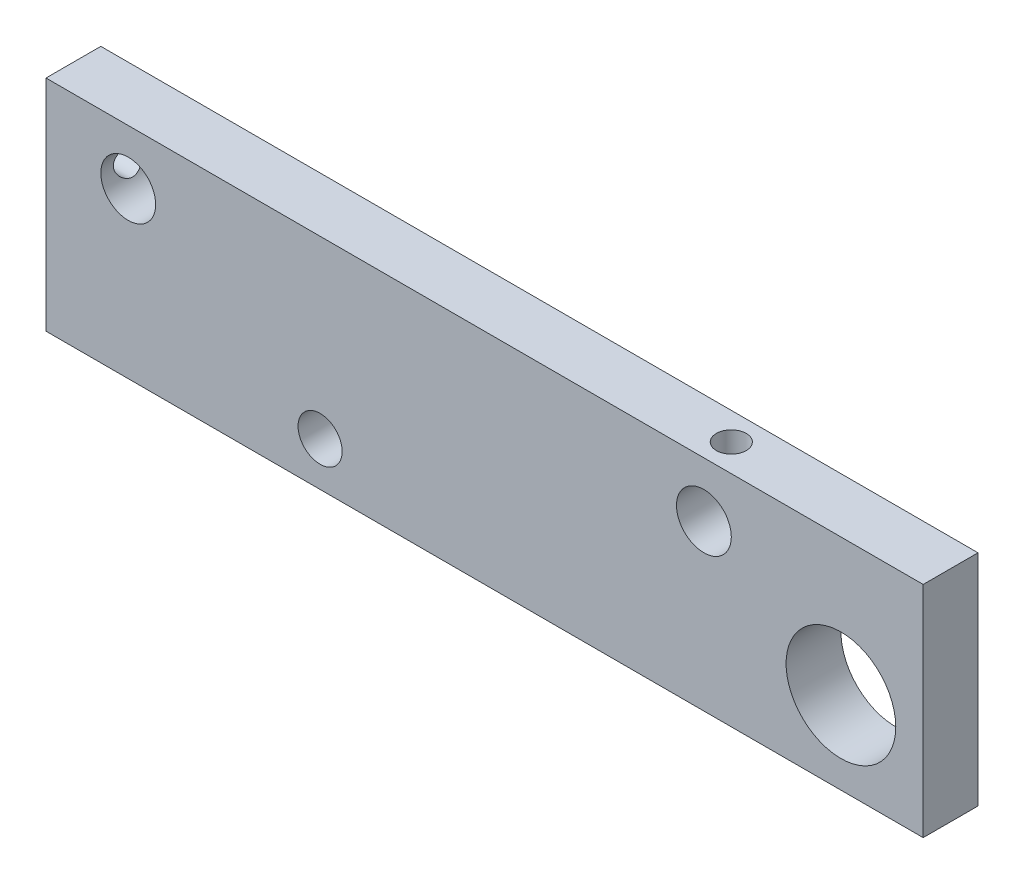
ISO-10303-21;
HEADER;
FILE_DESCRIPTION(('STEP AP214'),'2;1');
FILE_NAME('part.step','',(''),(''),'','','');
FILE_SCHEMA(('AUTOMOTIVE_DESIGN { 1 0 10303 214 1 1 1 1 }'));
ENDSEC;
DATA;
#1=APPLICATION_CONTEXT('core data for automotive mechanical design processes');
#2=APPLICATION_PROTOCOL_DEFINITION('international standard','automotive_design',2000,#1);
#3=PRODUCT_CONTEXT('',#1,'mechanical');
#4=PRODUCT('Part','Part','',(#3));
#5=PRODUCT_RELATED_PRODUCT_CATEGORY('part','',(#4));
#6=PRODUCT_DEFINITION_FORMATION('','',#4);
#7=PRODUCT_DEFINITION_CONTEXT('part definition',#1,'design');
#8=PRODUCT_DEFINITION('design','',#6,#7);
#9=PRODUCT_DEFINITION_SHAPE('','',#8);
#10=(LENGTH_UNIT() NAMED_UNIT(*) SI_UNIT(.MILLI.,.METRE.));
#11=(NAMED_UNIT(*) PLANE_ANGLE_UNIT() SI_UNIT($,.RADIAN.));
#12=(NAMED_UNIT(*) SI_UNIT($,.STERADIAN.) SOLID_ANGLE_UNIT());
#13=UNCERTAINTY_MEASURE_WITH_UNIT(LENGTH_MEASURE(1.E-05),#10,'distance_accuracy_value','');
#14=(GEOMETRIC_REPRESENTATION_CONTEXT(3) GLOBAL_UNCERTAINTY_ASSIGNED_CONTEXT((#13)) GLOBAL_UNIT_ASSIGNED_CONTEXT((#10,
#11,#12)) REPRESENTATION_CONTEXT('',''));
#15=CARTESIAN_POINT('',(0.,0.,0.));
#16=DIRECTION('',(0.,0.,1.));
#17=DIRECTION('',(1.,0.,0.));
#18=AXIS2_PLACEMENT_3D('',#15,#16,#17);
#19=CARTESIAN_POINT('',(0.,0.,6.35));
#20=DIRECTION('',(0.,0.,-1.));
#21=DIRECTION('',(-1.,0.,0.));
#22=AXIS2_PLACEMENT_3D('',#19,#20,#21);
#23=PLANE('',#22);
#24=CARTESIAN_POINT('',(31.75,5.08,6.35));
#25=DIRECTION('',(0.,0.,-1.));
#26=DIRECTION('',(-1.,0.,0.));
#27=AXIS2_PLACEMENT_3D('',#24,#25,#26);
#28=CIRCLE('',#27,2.5527);
#29=CARTESIAN_POINT('',(29.1973,5.08,6.35));
#30=VERTEX_POINT('',#29);
#31=EDGE_CURVE('E124',#30,#30,#28,.T.);
#32=ORIENTED_EDGE('',*,*,#31,.T.);
#33=EDGE_LOOP('',(#32));
#34=FACE_BOUND('',#33,.T.);
#35=DIRECTION('',(0.,-1.,0.));
#36=VECTOR('',#35,1.);
#37=CARTESIAN_POINT('',(0.,0.,6.35));
#38=LINE('',#37,#36);
#39=CARTESIAN_POINT('',(0.,25.4,6.35));
#40=VERTEX_POINT('',#39);
#41=CARTESIAN_POINT('',(0.,0.,6.35));
#42=VERTEX_POINT('',#41);
#43=EDGE_CURVE('E252',#40,#42,#38,.T.);
#44=ORIENTED_EDGE('',*,*,#43,.T.);
#45=DIRECTION('',(1.,0.,0.));
#46=VECTOR('',#45,1.);
#47=CARTESIAN_POINT('',(0.,0.,6.35));
#48=LINE('',#47,#46);
#49=CARTESIAN_POINT('',(101.6,0.,6.35));
#50=VERTEX_POINT('',#49);
#51=EDGE_CURVE('E91',#42,#50,#48,.T.);
#52=ORIENTED_EDGE('',*,*,#51,.T.);
#53=DIRECTION('',(0.,1.,0.));
#54=VECTOR('',#53,1.);
#55=CARTESIAN_POINT('',(101.6,0.,6.35));
#56=LINE('',#55,#54);
#57=CARTESIAN_POINT('',(101.6,25.4,6.35));
#58=VERTEX_POINT('',#57);
#59=EDGE_CURVE('E245',#50,#58,#56,.T.);
#60=ORIENTED_EDGE('',*,*,#59,.T.);
#61=DIRECTION('',(-1.,0.,0.));
#62=VECTOR('',#61,1.);
#63=CARTESIAN_POINT('',(0.,25.4,6.35));
#64=LINE('',#63,#62);
#65=EDGE_CURVE('E60',#58,#40,#64,.T.);
#66=ORIENTED_EDGE('',*,*,#65,.T.);
#67=EDGE_LOOP('',(#44,#52,#60,#66));
#68=FACE_BOUND('',#67,.T.);
#69=CARTESIAN_POINT('',(92.075,9.525,6.35));
#70=DIRECTION('',(0.,0.,1.));
#71=DIRECTION('',(1.,0.,0.));
#72=AXIS2_PLACEMENT_3D('',#69,#70,#71);
#73=CIRCLE('',#72,6.35000000000001);
#74=CARTESIAN_POINT('',(98.425,9.525,6.35));
#75=VERTEX_POINT('',#74);
#76=EDGE_CURVE('E267',#75,#75,#73,.T.);
#77=ORIENTED_EDGE('',*,*,#76,.F.);
#78=EDGE_LOOP('',(#77));
#79=FACE_BOUND('',#78,.T.);
#80=CARTESIAN_POINT('',(76.2,19.05,6.35));
#81=DIRECTION('',(0.,0.,1.));
#82=DIRECTION('',(1.,0.,0.));
#83=AXIS2_PLACEMENT_3D('',#80,#81,#82);
#84=CIRCLE('',#83,3.175);
#85=CARTESIAN_POINT('',(79.375,19.05,6.35));
#86=VERTEX_POINT('',#85);
#87=EDGE_CURVE('E277',#86,#86,#84,.T.);
#88=ORIENTED_EDGE('',*,*,#87,.F.);
#89=EDGE_LOOP('',(#88));
#90=FACE_BOUND('',#89,.T.);
#91=CARTESIAN_POINT('',(9.525,19.05,6.35));
#92=DIRECTION('',(0.,0.,1.));
#93=DIRECTION('',(1.,0.,0.));
#94=AXIS2_PLACEMENT_3D('',#91,#92,#93);
#95=CIRCLE('',#94,3.175);
#96=CARTESIAN_POINT('',(12.7,19.05,6.35));
#97=VERTEX_POINT('',#96);
#98=EDGE_CURVE('E292',#97,#97,#95,.T.);
#99=ORIENTED_EDGE('',*,*,#98,.F.);
#100=EDGE_LOOP('',(#99));
#101=FACE_BOUND('',#100,.T.);
#102=ADVANCED_FACE('F42',(#34,#68,#79,#90,#101),#23,.F.);
#103=CARTESIAN_POINT('',(0.,0.,0.));
#104=DIRECTION('',(0.,0.,-1.));
#105=DIRECTION('',(-1.,0.,0.));
#106=AXIS2_PLACEMENT_3D('',#103,#104,#105);
#107=PLANE('',#106);
#108=CARTESIAN_POINT('',(31.75,5.08,0.));
#109=DIRECTION('',(0.,0.,-1.));
#110=DIRECTION('',(-1.,0.,0.));
#111=AXIS2_PLACEMENT_3D('',#108,#109,#110);
#112=CIRCLE('',#111,2.55269999999999);
#113=CARTESIAN_POINT('',(29.1973,5.08,0.));
#114=VERTEX_POINT('',#113);
#115=EDGE_CURVE('E480',#114,#114,#112,.T.);
#116=ORIENTED_EDGE('',*,*,#115,.F.);
#117=EDGE_LOOP('',(#116));
#118=FACE_BOUND('',#117,.T.);
#119=CARTESIAN_POINT('',(76.2,19.05,0.));
#120=DIRECTION('',(0.,0.,1.));
#121=DIRECTION('',(1.,0.,0.));
#122=AXIS2_PLACEMENT_3D('',#119,#120,#121);
#123=CIRCLE('',#122,3.175);
#124=CARTESIAN_POINT('',(79.375,19.05,0.));
#125=VERTEX_POINT('',#124);
#126=EDGE_CURVE('E280',#125,#125,#123,.T.);
#127=ORIENTED_EDGE('',*,*,#126,.T.);
#128=EDGE_LOOP('',(#127));
#129=FACE_BOUND('',#128,.T.);
#130=DIRECTION('',(0.,-1.,0.));
#131=VECTOR('',#130,1.);
#132=CARTESIAN_POINT('',(0.,0.,0.));
#133=LINE('',#132,#131);
#134=CARTESIAN_POINT('',(0.,25.4,0.));
#135=VERTEX_POINT('',#134);
#136=CARTESIAN_POINT('',(0.,0.,0.));
#137=VERTEX_POINT('',#136);
#138=EDGE_CURVE('E243',#135,#137,#133,.T.);
#139=ORIENTED_EDGE('',*,*,#138,.F.);
#140=DIRECTION('',(-1.,0.,0.));
#141=VECTOR('',#140,1.);
#142=CARTESIAN_POINT('',(0.,25.4,0.));
#143=LINE('',#142,#141);
#144=CARTESIAN_POINT('',(101.6,25.4,0.));
#145=VERTEX_POINT('',#144);
#146=EDGE_CURVE('E84',#145,#135,#143,.T.);
#147=ORIENTED_EDGE('',*,*,#146,.F.);
#148=DIRECTION('',(0.,1.,0.));
#149=VECTOR('',#148,1.);
#150=CARTESIAN_POINT('',(101.6,0.,0.));
#151=LINE('',#150,#149);
#152=CARTESIAN_POINT('',(101.6,0.,0.));
#153=VERTEX_POINT('',#152);
#154=EDGE_CURVE('E78',#153,#145,#151,.T.);
#155=ORIENTED_EDGE('',*,*,#154,.F.);
#156=DIRECTION('',(1.,0.,0.));
#157=VECTOR('',#156,1.);
#158=CARTESIAN_POINT('',(0.,0.,0.));
#159=LINE('',#158,#157);
#160=EDGE_CURVE('E236',#137,#153,#159,.T.);
#161=ORIENTED_EDGE('',*,*,#160,.F.);
#162=EDGE_LOOP('',(#139,#147,#155,#161));
#163=FACE_BOUND('',#162,.T.);
#164=CARTESIAN_POINT('',(92.075,9.525,0.));
#165=DIRECTION('',(0.,0.,1.));
#166=DIRECTION('',(1.,0.,0.));
#167=AXIS2_PLACEMENT_3D('',#164,#165,#166);
#168=CIRCLE('',#167,6.35000000000001);
#169=CARTESIAN_POINT('',(98.425,9.525,0.));
#170=VERTEX_POINT('',#169);
#171=EDGE_CURVE('E271',#170,#170,#168,.T.);
#172=ORIENTED_EDGE('',*,*,#171,.T.);
#173=EDGE_LOOP('',(#172));
#174=FACE_BOUND('',#173,.T.);
#175=CARTESIAN_POINT('',(9.525,19.05,0.));
#176=DIRECTION('',(0.,0.,1.));
#177=DIRECTION('',(1.,0.,0.));
#178=AXIS2_PLACEMENT_3D('',#175,#176,#177);
#179=CIRCLE('',#178,3.175);
#180=CARTESIAN_POINT('',(12.7,19.05,0.));
#181=VERTEX_POINT('',#180);
#182=EDGE_CURVE('E295',#181,#181,#179,.T.);
#183=ORIENTED_EDGE('',*,*,#182,.T.);
#184=EDGE_LOOP('',(#183));
#185=FACE_BOUND('',#184,.T.);
#186=ADVANCED_FACE('F203',(#118,#129,#163,#174,#185),#107,.T.);
#187=CARTESIAN_POINT('',(0.,0.,6.35));
#188=DIRECTION('',(1.,0.,0.));
#189=DIRECTION('',(0.,0.,-1.));
#190=AXIS2_PLACEMENT_3D('',#187,#188,#189);
#191=PLANE('',#190);
#192=CARTESIAN_POINT('',(0.,19.05,3.175));
#193=DIRECTION('',(-1.,0.,0.));
#194=DIRECTION('',(0.,0.,1.));
#195=AXIS2_PLACEMENT_3D('',#192,#193,#194);
#196=CIRCLE('',#195,1.72719999999999);
#197=CARTESIAN_POINT('',(0.,19.05,4.90219999999999));
#198=VERTEX_POINT('',#197);
#199=EDGE_CURVE('E147',#198,#198,#196,.T.);
#200=ORIENTED_EDGE('',*,*,#199,.F.);
#201=EDGE_LOOP('',(#200));
#202=FACE_BOUND('',#201,.T.);
#203=ORIENTED_EDGE('',*,*,#138,.T.);
#204=DIRECTION('',(0.,0.,-1.));
#205=VECTOR('',#204,1.);
#206=CARTESIAN_POINT('',(0.,0.,6.35));
#207=LINE('',#206,#205);
#208=EDGE_CURVE('E11',#42,#137,#207,.T.);
#209=ORIENTED_EDGE('',*,*,#208,.F.);
#210=ORIENTED_EDGE('',*,*,#43,.F.);
#211=DIRECTION('',(0.,0.,-1.));
#212=VECTOR('',#211,1.);
#213=CARTESIAN_POINT('',(0.,25.4,6.35));
#214=LINE('',#213,#212);
#215=EDGE_CURVE('E256',#40,#135,#214,.T.);
#216=ORIENTED_EDGE('',*,*,#215,.T.);
#217=EDGE_LOOP('',(#203,#209,#210,#216));
#218=FACE_BOUND('',#217,.T.);
#219=ADVANCED_FACE('F44',(#202,#218),#191,.F.);
#220=CARTESIAN_POINT('',(0.,0.,6.35));
#221=DIRECTION('',(0.,1.,0.));
#222=DIRECTION('',(0.,0.,1.));
#223=AXIS2_PLACEMENT_3D('',#220,#221,#222);
#224=PLANE('',#223);
#225=CARTESIAN_POINT('',(81.28,0.,3.175));
#226=DIRECTION('',(0.,-1.,0.));
#227=DIRECTION('',(0.,0.,-1.));
#228=AXIS2_PLACEMENT_3D('',#225,#226,#227);
#229=CIRCLE('',#228,1.7272);
#230=CARTESIAN_POINT('',(81.28,0.,1.4478));
#231=VERTEX_POINT('',#230);
#232=EDGE_CURVE('E116',#231,#231,#229,.T.);
#233=ORIENTED_EDGE('',*,*,#232,.F.);
#234=EDGE_LOOP('',(#233));
#235=FACE_BOUND('',#234,.T.);
#236=CARTESIAN_POINT('',(55.88,0.,3.175));
#237=DIRECTION('',(0.,-1.,0.));
#238=DIRECTION('',(0.,0.,-1.));
#239=AXIS2_PLACEMENT_3D('',#236,#237,#238);
#240=CIRCLE('',#239,1.7272);
#241=CARTESIAN_POINT('',(55.88,0.,1.4478));
#242=VERTEX_POINT('',#241);
#243=EDGE_CURVE('E115',#242,#242,#240,.T.);
#244=ORIENTED_EDGE('',*,*,#243,.F.);
#245=EDGE_LOOP('',(#244));
#246=FACE_BOUND('',#245,.T.);
#247=CARTESIAN_POINT('',(12.7,0.,3.175));
#248=DIRECTION('',(0.,-1.,0.));
#249=DIRECTION('',(0.,0.,-1.));
#250=AXIS2_PLACEMENT_3D('',#247,#248,#249);
#251=CIRCLE('',#250,1.7272);
#252=CARTESIAN_POINT('',(12.7,0.,1.4478));
#253=VERTEX_POINT('',#252);
#254=EDGE_CURVE('E131',#253,#253,#251,.T.);
#255=ORIENTED_EDGE('',*,*,#254,.F.);
#256=EDGE_LOOP('',(#255));
#257=FACE_BOUND('',#256,.T.);
#258=CARTESIAN_POINT('',(68.58,0.,3.175));
#259=DIRECTION('',(0.,-1.,0.));
#260=DIRECTION('',(0.,0.,-1.));
#261=AXIS2_PLACEMENT_3D('',#258,#259,#260);
#262=CIRCLE('',#261,1.7272);
#263=CARTESIAN_POINT('',(68.58,0.,1.4478));
#264=VERTEX_POINT('',#263);
#265=EDGE_CURVE('E139',#264,#264,#262,.T.);
#266=ORIENTED_EDGE('',*,*,#265,.F.);
#267=EDGE_LOOP('',(#266));
#268=FACE_BOUND('',#267,.T.);
#269=ORIENTED_EDGE('',*,*,#160,.T.);
#270=DIRECTION('',(0.,0.,-1.));
#271=VECTOR('',#270,1.);
#272=CARTESIAN_POINT('',(101.6,0.,6.35));
#273=LINE('',#272,#271);
#274=EDGE_CURVE('E52',#50,#153,#273,.T.);
#275=ORIENTED_EDGE('',*,*,#274,.F.);
#276=ORIENTED_EDGE('',*,*,#51,.F.);
#277=ORIENTED_EDGE('',*,*,#208,.T.);
#278=EDGE_LOOP('',(#269,#275,#276,#277));
#279=FACE_BOUND('',#278,.T.);
#280=ADVANCED_FACE('F222',(#235,#246,#257,#268,#279),#224,.F.);
#281=CARTESIAN_POINT('',(101.6,0.,6.35));
#282=DIRECTION('',(-1.,0.,0.));
#283=DIRECTION('',(0.,0.,1.));
#284=AXIS2_PLACEMENT_3D('',#281,#282,#283);
#285=PLANE('',#284);
#286=ORIENTED_EDGE('',*,*,#154,.T.);
#287=DIRECTION('',(0.,0.,-1.));
#288=VECTOR('',#287,1.);
#289=CARTESIAN_POINT('',(101.6,25.4,6.35));
#290=LINE('',#289,#288);
#291=EDGE_CURVE('E247',#58,#145,#290,.T.);
#292=ORIENTED_EDGE('',*,*,#291,.F.);
#293=ORIENTED_EDGE('',*,*,#59,.F.);
#294=ORIENTED_EDGE('',*,*,#274,.T.);
#295=EDGE_LOOP('',(#286,#292,#293,#294));
#296=FACE_BOUND('',#295,.T.);
#297=ADVANCED_FACE('F219',(#296),#285,.F.);
#298=CARTESIAN_POINT('',(0.,25.4,6.35));
#299=DIRECTION('',(0.,-1.,0.));
#300=DIRECTION('',(0.,0.,-1.));
#301=AXIS2_PLACEMENT_3D('',#298,#299,#300);
#302=PLANE('',#301);
#303=CARTESIAN_POINT('',(76.2,25.4,3.175));
#304=DIRECTION('',(0.,1.,0.));
#305=DIRECTION('',(0.,0.,1.));
#306=AXIS2_PLACEMENT_3D('',#303,#304,#305);
#307=CIRCLE('',#306,1.72719999999998);
#308=CARTESIAN_POINT('',(76.2,25.4,4.90219999999998));
#309=VERTEX_POINT('',#308);
#310=EDGE_CURVE('E160',#309,#309,#307,.T.);
#311=ORIENTED_EDGE('',*,*,#310,.F.);
#312=EDGE_LOOP('',(#311));
#313=FACE_BOUND('',#312,.T.);
#314=ORIENTED_EDGE('',*,*,#146,.T.);
#315=ORIENTED_EDGE('',*,*,#215,.F.);
#316=ORIENTED_EDGE('',*,*,#65,.F.);
#317=ORIENTED_EDGE('',*,*,#291,.T.);
#318=EDGE_LOOP('',(#314,#315,#316,#317));
#319=FACE_BOUND('',#318,.T.);
#320=ADVANCED_FACE('F216',(#313,#319),#302,.F.);
#321=CARTESIAN_POINT('',(92.075,9.525,6.35));
#322=DIRECTION('',(0.,0.,-1.));
#323=DIRECTION('',(-1.,0.,0.));
#324=AXIS2_PLACEMENT_3D('',#321,#322,#323);
#325=CYLINDRICAL_SURFACE('',#324,6.35000000000001);
#326=ORIENTED_EDGE('',*,*,#76,.T.);
#327=EDGE_LOOP('',(#326));
#328=FACE_BOUND('',#327,.T.);
#329=ORIENTED_EDGE('',*,*,#171,.F.);
#330=EDGE_LOOP('',(#329));
#331=FACE_BOUND('',#330,.T.);
#332=ADVANCED_FACE('F213',(#328,#331),#325,.F.);
#333=CARTESIAN_POINT('',(76.2,19.05,6.35));
#334=DIRECTION('',(0.,0.,-1.));
#335=DIRECTION('',(-1.,0.,0.));
#336=AXIS2_PLACEMENT_3D('',#333,#334,#335);
#337=CYLINDRICAL_SURFACE('',#336,3.175);
#338=CARTESIAN_POINT('',(76.2,22.225,4.90219999999999));
#339=CARTESIAN_POINT('',(76.110183267013,22.224994842001,4.90219426316033));
#340=CARTESIAN_POINT('',(76.0202896032224,22.2211497592581,4.89515353824675));
#341=CARTESIAN_POINT('',(75.8432209639998,22.2061465963456,4.86733214119055));
#342=CARTESIAN_POINT('',(75.7560500680111,22.1949780470802,4.84653179892228));
#343=CARTESIAN_POINT('',(75.5872449194557,22.1664814163209,4.79227558287018));
#344=CARTESIAN_POINT('',(75.5055895883976,22.1491785740184,4.7588715306506));
#345=CARTESIAN_POINT('',(75.3492002679151,22.1099468194807,4.68065998275856));
#346=CARTESIAN_POINT('',(75.2744664814582,22.0880177716484,4.6358521528258));
#347=CARTESIAN_POINT('',(75.1283421284245,22.0397307289578,4.53268302184071));
#348=CARTESIAN_POINT('',(75.0575221493316,22.0131732150285,4.473608560259));
#349=CARTESIAN_POINT('',(74.9262561522438,21.9591664142974,4.34514660815034));
#350=CARTESIAN_POINT('',(74.8658196101394,21.9317163398266,4.27574980409458));
#351=CARTESIAN_POINT('',(74.7511885181865,21.8759530484443,4.12068927626324));
#352=CARTESIAN_POINT('',(74.6981475295464,21.8478092947721,4.03410392840672));
#353=CARTESIAN_POINT('',(74.6075887759796,21.7972815216645,3.85160814769005));
#354=CARTESIAN_POINT('',(74.5700588243197,21.7748929857102,3.75570510902081));
#355=CARTESIAN_POINT('',(74.5142339987558,21.7406945421021,3.56331974847051));
#356=CARTESIAN_POINT('',(74.4948764058784,21.7283071129177,3.46725444315248));
#357=CARTESIAN_POINT('',(74.4727831669528,21.7141210926539,3.27251296602227));
#358=CARTESIAN_POINT('',(74.4700247583745,21.7123080010469,3.1738405560504));
#359=CARTESIAN_POINT('',(74.4804333789233,21.7190305122791,2.9924664257384));
#360=CARTESIAN_POINT('',(74.4913039535474,21.7260742808087,2.90956228487491));
#361=CARTESIAN_POINT('',(74.5246095408713,21.7470494414497,2.74701296463368));
#362=CARTESIAN_POINT('',(74.5470495877459,21.7609838317398,2.66736922023529));
#363=CARTESIAN_POINT('',(74.6031707713032,21.7944201285136,2.5113856243492));
#364=CARTESIAN_POINT('',(74.63708760068,21.814037413562,2.43515650840408));
#365=CARTESIAN_POINT('',(74.7149995166023,21.8566651506685,2.28908015534768));
#366=CARTESIAN_POINT('',(74.7589990023016,21.8796770822756,2.21923572259403));
#367=CARTESIAN_POINT('',(74.8636886602055,21.9307610359601,2.07660391669395));
#368=CARTESIAN_POINT('',(74.9259051322662,21.9590669301131,2.00501637617155));
#369=CARTESIAN_POINT('',(75.0614438541865,22.0147406170481,1.87273880325029));
#370=CARTESIAN_POINT('',(75.1347733419486,22.0421077840868,1.81205592977166));
#371=CARTESIAN_POINT('',(75.2963397847503,22.0949453965869,1.69956420536644));
#372=CARTESIAN_POINT('',(75.3852320372337,22.1201808054116,1.64857662560586));
#373=CARTESIAN_POINT('',(75.5720385009356,22.163752551017,1.56272760937983));
#374=CARTESIAN_POINT('',(75.6699442824126,22.1820952540914,1.52785128524924));
#375=CARTESIAN_POINT('',(75.8623675517872,22.2083501933361,1.47848486278067));
#376=CARTESIAN_POINT('',(75.9563682281967,22.2170667122662,1.46241455863197));
#377=CARTESIAN_POINT('',(76.1461137218816,22.2259596186924,1.44602149624867));
#378=CARTESIAN_POINT('',(76.241857427538,22.2261412707523,1.44568903043899));
#379=CARTESIAN_POINT('',(76.4226303001239,22.2183542676247,1.4600396511867));
#380=CARTESIAN_POINT('',(76.5078119733897,22.2111596471146,1.47329669083816));
#381=CARTESIAN_POINT('',(76.6745264217491,22.1904628928592,1.51205979224464));
#382=CARTESIAN_POINT('',(76.7560588230791,22.1769601146361,1.53756710556591));
#383=CARTESIAN_POINT('',(76.9154369218934,22.1444386365722,1.60055149841364));
#384=CARTESIAN_POINT('',(76.9931516700883,22.1252982339629,1.63829475616213));
#385=CARTESIAN_POINT('',(77.1413556688846,22.0832191228263,1.72433789832278));
#386=CARTESIAN_POINT('',(77.2118421966566,22.0602789914109,1.77264173954321));
#387=CARTESIAN_POINT('',(77.3518792553385,22.0097184673047,1.88453874061452));
#388=CARTESIAN_POINT('',(77.4204665404861,21.9818609907241,1.9492313333052));
#389=CARTESIAN_POINT('',(77.5463260558171,21.9262433303561,2.08896090069408));
#390=CARTESIAN_POINT('',(77.6035869561702,21.8984832710008,2.16400810708042));
#391=CARTESIAN_POINT('',(77.7093040607395,21.843997029641,2.32911456803238));
#392=CARTESIAN_POINT('',(77.7567969583979,21.8174988325876,2.4198733475382));
#393=CARTESIAN_POINT('',(77.8353697529338,21.7718154792425,2.60991790282002));
#394=CARTESIAN_POINT('',(77.8664734230325,21.7526197417534,2.70919108354075));
#395=CARTESIAN_POINT('',(77.9082838229516,21.7263688011258,2.90324719011799));
#396=CARTESIAN_POINT('',(77.9206833212737,21.718312524142,2.99752446352124));
#397=CARTESIAN_POINT('',(77.929756885217,21.7124437414767,3.18712206760348));
#398=CARTESIAN_POINT('',(77.9264433729609,21.7146231438342,3.28244151491501));
#399=CARTESIAN_POINT('',(77.9058275980379,21.7278506136661,3.4581247925225));
#400=CARTESIAN_POINT('',(77.8904112311361,21.7377017050996,3.53881438229933));
#401=CARTESIAN_POINT('',(77.8486703373827,21.7635050374682,3.69629218816028));
#402=CARTESIAN_POINT('',(77.8223415022716,21.7794596879063,3.77307884990559));
#403=CARTESIAN_POINT('',(77.7577484429732,21.816860182444,3.92597018057133));
#404=CARTESIAN_POINT('',(77.7188406927072,21.8385870696544,4.00173178768551));
#405=CARTESIAN_POINT('',(77.6308145793866,21.8847601342395,4.14615951711862));
#406=CARTESIAN_POINT('',(77.5816907545949,21.9092077629188,4.21482181447284));
#407=CARTESIAN_POINT('',(77.4659002763112,21.9625200032383,4.3540303383579));
#408=CARTESIAN_POINT('',(77.3977009735916,21.9914898770765,4.42326849457057));
#409=CARTESIAN_POINT('',(77.2501131647898,22.0473510533415,4.54974712844455));
#410=CARTESIAN_POINT('',(77.170716985738,22.0742409106468,4.60697931121357));
#411=CARTESIAN_POINT('',(76.9996483323246,22.123981265466,4.70928011125118));
#412=CARTESIAN_POINT('',(76.9076728384087,22.1466816659454,4.75391931330015));
#413=CARTESIAN_POINT('',(76.7159912222075,22.1843011288306,4.82648714665707));
#414=CARTESIAN_POINT('',(76.6163060077164,22.1992404432213,4.8544592977591));
#415=CARTESIAN_POINT('',(76.4628760211871,22.2145294100806,4.88289225903148));
#416=CARTESIAN_POINT('',(76.4106508181132,22.2184409225074,4.89011759952543));
#417=CARTESIAN_POINT('',(76.3056259463871,22.2236777304677,4.89977314994272));
#418=CARTESIAN_POINT('',(76.2528262794477,22.2250030337097,4.90220337415852));
#419=CARTESIAN_POINT('',(76.2,22.225,4.90219999999999));
#420=B_SPLINE_CURVE_WITH_KNOTS('',3,(#338,#339,#340,#341,#342,#343,#344,#345,#346,#347,#348,
#349,#350,#351,#352,#353,#354,#355,#356,#357,#358,#359,#360,#361,#362,#363,#364,#365,#366,#367,
#368,#369,#370,#371,#372,#373,#374,#375,#376,#377,#378,#379,#380,#381,#382,#383,#384,#385,#386,
#387,#388,#389,#390,#391,#392,#393,#394,#395,#396,#397,#398,#399,#400,#401,#402,#403,#404,#405,
#406,#407,#408,#409,#410,#411,#412,#413,#414,#415,#416,#417,#418,#419),.UNSPECIFIED.,.T.,.F.,(4,
2,2,2,2,2,2,2,2,2,2,2,2,2,2,2,2,2,2,2,2,2,2,2,2,2,2,2,2,2,2,2,2,2,2,2,2,2,2,2,4),(0.,
0.269237366741938,0.53886045720665,0.807386833520662,1.07592108161609,1.36266948063225,
1.64967819109356,1.96419704531973,2.27846831600627,2.57294341145818,2.86701459980267,
3.11756500584304,3.36822452493013,3.62438021478772,3.88064788119477,4.17633401900357,
4.472213571347,4.78711425412073,5.10172336681181,5.38739145348505,5.67288332913719,
5.93120440761279,6.18955188343686,6.4539459483155,6.71843924587247,7.01214559552771,
7.30614427141863,7.62186818462157,7.937132858264,8.22166481147845,8.50597186181724,
8.75310154925953,9.0003288969682,9.26301971807987,9.52585134216129,9.82874467547088,
10.131846592656,10.4442934112149,10.7559207748692,10.9142749065924,11.07262856632),.UNSPECIFIED.);
#421=CARTESIAN_POINT('',(76.2,22.225,4.90219999999999));
#422=VERTEX_POINT('',#421);
#423=EDGE_CURVE('E301',#422,#422,#420,.T.);
#424=ORIENTED_EDGE('',*,*,#423,.F.);
#425=EDGE_LOOP('',(#424));
#426=FACE_BOUND('',#425,.T.);
#427=ORIENTED_EDGE('',*,*,#87,.T.);
#428=EDGE_LOOP('',(#427));
#429=FACE_BOUND('',#428,.T.);
#430=ORIENTED_EDGE('',*,*,#126,.F.);
#431=EDGE_LOOP('',(#430));
#432=FACE_BOUND('',#431,.T.);
#433=ADVANCED_FACE('F309',(#426,#429,#432),#337,.F.);
#434=CARTESIAN_POINT('',(9.525,19.05,6.35));
#435=DIRECTION('',(0.,0.,-1.));
#436=DIRECTION('',(-1.,0.,0.));
#437=AXIS2_PLACEMENT_3D('',#434,#435,#436);
#438=CYLINDRICAL_SURFACE('',#437,3.175);
#439=CARTESIAN_POINT('',(6.35,19.05,4.90219999999999));
#440=CARTESIAN_POINT('',(6.35000515799903,18.960183267013,4.90219426316033));
#441=CARTESIAN_POINT('',(6.35385024074188,18.8702896032224,4.89515353824675));
#442=CARTESIAN_POINT('',(6.36885340365438,18.6932209639998,4.86733214119055));
#443=CARTESIAN_POINT('',(6.38002195291976,18.6060500680111,4.84653179892229));
#444=CARTESIAN_POINT('',(6.40851858367905,18.4372449194557,4.79227558287018));
#445=CARTESIAN_POINT('',(6.42582142598158,18.3555895883976,4.75887153065061));
#446=CARTESIAN_POINT('',(6.46505318051926,18.1992002679151,4.68065998275857));
#447=CARTESIAN_POINT('',(6.48698222835158,18.1244664814582,4.63585215282581));
#448=CARTESIAN_POINT('',(6.53526927104219,17.9783421284245,4.53268302184071));
#449=CARTESIAN_POINT('',(6.56182678497154,17.9075221493316,4.473608560259));
#450=CARTESIAN_POINT('',(6.61583358570262,17.7762561522438,4.34514660815034));
#451=CARTESIAN_POINT('',(6.64328366017336,17.7158196101394,4.27574980409459));
#452=CARTESIAN_POINT('',(6.69904695155567,17.6011885181865,4.12068927626324));
#453=CARTESIAN_POINT('',(6.72719070522792,17.5481475295464,4.03410392840672));
#454=CARTESIAN_POINT('',(6.77771847833549,17.4575887759796,3.85160814769005));
#455=CARTESIAN_POINT('',(6.80010701428976,17.4200588243197,3.75570510902082));
#456=CARTESIAN_POINT('',(6.83430545789791,17.3642339987558,3.56331974847052));
#457=CARTESIAN_POINT('',(6.84669288708234,17.3448764058784,3.4672544431525));
#458=CARTESIAN_POINT('',(6.8608789073461,17.3227831669528,3.27251296602229));
#459=CARTESIAN_POINT('',(6.86269199895308,17.3200247583745,3.17384055605041));
#460=CARTESIAN_POINT('',(6.85596948772094,17.3304333789233,2.99246642573842));
#461=CARTESIAN_POINT('',(6.84892571919135,17.3413039535474,2.90956228487492));
#462=CARTESIAN_POINT('',(6.82795055855032,17.3746095408713,2.74701296463369));
#463=CARTESIAN_POINT('',(6.81401616826019,17.3970495877459,2.66736922023531));
#464=CARTESIAN_POINT('',(6.78057987148641,17.4531707713032,2.51138562434921));
#465=CARTESIAN_POINT('',(6.760962586438,17.48708760068,2.43515650840409));
#466=CARTESIAN_POINT('',(6.71833484933147,17.5649995166023,2.28908015534769));
#467=CARTESIAN_POINT('',(6.69532291772442,17.6089990023016,2.21923572259404));
#468=CARTESIAN_POINT('',(6.64423896403994,17.7136886602055,2.07660391669396));
#469=CARTESIAN_POINT('',(6.61593306988695,17.7759051322662,2.00501637617156));
#470=CARTESIAN_POINT('',(6.56025938295194,17.9114438541865,1.8727388032503));
#471=CARTESIAN_POINT('',(6.53289221591316,17.9847733419486,1.81205592977166));
#472=CARTESIAN_POINT('',(6.48005460341306,18.1463397847503,1.69956420536644));
#473=CARTESIAN_POINT('',(6.45481919458839,18.2352320372338,1.64857662560586));
#474=CARTESIAN_POINT('',(6.41124744898303,18.4220385009356,1.56272760937983));
#475=CARTESIAN_POINT('',(6.39290474590858,18.5199442824126,1.52785128524924));
#476=CARTESIAN_POINT('',(6.36664980666392,18.7123675517872,1.47848486278067));
#477=CARTESIAN_POINT('',(6.35793328773384,18.8063682281967,1.46241455863197));
#478=CARTESIAN_POINT('',(6.34904038130762,18.9961137218816,1.44602149624867));
#479=CARTESIAN_POINT('',(6.34885872924774,19.0918574275379,1.44568903043899));
#480=CARTESIAN_POINT('',(6.35664573237529,19.2726303001239,1.4600396511867));
#481=CARTESIAN_POINT('',(6.36384035288536,19.3578119733897,1.47329669083815));
#482=CARTESIAN_POINT('',(6.38453710714075,19.524526421749,1.51205979224463));
#483=CARTESIAN_POINT('',(6.39803988536393,19.6060588230791,1.5375671055659));
#484=CARTESIAN_POINT('',(6.43056136342776,19.7654369218934,1.60055149841364));
#485=CARTESIAN_POINT('',(6.44970176603713,19.8431516700883,1.63829475616212));
#486=CARTESIAN_POINT('',(6.49178087717367,19.9913556688846,1.72433789832277));
#487=CARTESIAN_POINT('',(6.51472100858906,20.0618421966567,1.7726417395432));
#488=CARTESIAN_POINT('',(6.56528153269526,20.2018792553385,1.88453874061452));
#489=CARTESIAN_POINT('',(6.59313900927594,20.2704665404861,1.94923133330519));
#490=CARTESIAN_POINT('',(6.64875666964387,20.3963260558171,2.08896090069407));
#491=CARTESIAN_POINT('',(6.67651672899922,20.4535869561702,2.16400810708041));
#492=CARTESIAN_POINT('',(6.73100297035897,20.5593040607395,2.32911456803237));
#493=CARTESIAN_POINT('',(6.7575011674124,20.6067969583979,2.41987334753819));
#494=CARTESIAN_POINT('',(6.80318452075749,20.6853697529338,2.60991790282001));
#495=CARTESIAN_POINT('',(6.82238025824656,20.7164734230325,2.70919108354074));
#496=CARTESIAN_POINT('',(6.84863119887416,20.7582838229517,2.90324719011798));
#497=CARTESIAN_POINT('',(6.85668747585799,20.7706833212737,2.99752446352123));
#498=CARTESIAN_POINT('',(6.86255625852333,20.779756885217,3.18712206760347));
#499=CARTESIAN_POINT('',(6.86037685616578,20.7764433729609,3.28244151491499));
#500=CARTESIAN_POINT('',(6.84714938633386,20.7558275980379,3.45812479252249));
#501=CARTESIAN_POINT('',(6.8372982949004,20.7404112311361,3.53881438229931));
#502=CARTESIAN_POINT('',(6.81149496253179,20.6986703373827,3.69629218816026));
#503=CARTESIAN_POINT('',(6.79554031209373,20.6723415022716,3.77307884990558));
#504=CARTESIAN_POINT('',(6.75813981755597,20.6077484429732,3.92597018057132));
#505=CARTESIAN_POINT('',(6.73641293034562,20.5688406927072,4.0017317876855));
#506=CARTESIAN_POINT('',(6.69023986576053,20.4808145793866,4.14615951711861));
#507=CARTESIAN_POINT('',(6.66579223708124,20.4316907545949,4.21482181447284));
#508=CARTESIAN_POINT('',(6.61247999676169,20.3159002763112,4.35403033835789));
#509=CARTESIAN_POINT('',(6.58351012292351,20.2477009735917,4.42326849457056));
#510=CARTESIAN_POINT('',(6.52764894665853,20.1001131647899,4.54974712844454));
#511=CARTESIAN_POINT('',(6.50075908935325,20.0207169857381,4.60697931121356));
#512=CARTESIAN_POINT('',(6.45101873453397,19.8496483323246,4.70928011125118));
#513=CARTESIAN_POINT('',(6.42831833405463,19.7576728384087,4.75391931330015));
#514=CARTESIAN_POINT('',(6.39069887116945,19.5659912222075,4.82648714665707));
#515=CARTESIAN_POINT('',(6.37575955677866,19.4663060077165,4.8544592977591));
#516=CARTESIAN_POINT('',(6.36047058991945,19.3128760211871,4.88289225903148));
#517=CARTESIAN_POINT('',(6.35655907749265,19.2606508181132,4.89011759952543));
#518=CARTESIAN_POINT('',(6.35132226953232,19.1556259463871,4.89977314994272));
#519=CARTESIAN_POINT('',(6.34999696629026,19.1028262794477,4.90220337415852));
#520=CARTESIAN_POINT('',(6.35,19.05,4.90219999999999));
#521=B_SPLINE_CURVE_WITH_KNOTS('',3,(#439,#440,#441,#442,#443,#444,#445,#446,#447,#448,#449,
#450,#451,#452,#453,#454,#455,#456,#457,#458,#459,#460,#461,#462,#463,#464,#465,#466,#467,#468,
#469,#470,#471,#472,#473,#474,#475,#476,#477,#478,#479,#480,#481,#482,#483,#484,#485,#486,#487,
#488,#489,#490,#491,#492,#493,#494,#495,#496,#497,#498,#499,#500,#501,#502,#503,#504,#505,#506,
#507,#508,#509,#510,#511,#512,#513,#514,#515,#516,#517,#518,#519,#520),.UNSPECIFIED.,.T.,.F.,(4,
2,2,2,2,2,2,2,2,2,2,2,2,2,2,2,2,2,2,2,2,2,2,2,2,2,2,2,2,2,2,2,2,2,2,2,2,2,2,2,4),(0.,
0.269237366741941,0.538860457206646,0.807386833520665,1.07592108161609,1.36266948063225,
1.64967819109357,1.96419704531974,2.27846831600626,2.57294341145818,2.86701459980266,
3.11756500584303,3.36822452493013,3.62438021478772,3.88064788119477,4.17633401900356,
4.472213571347,4.78711425412074,5.10172336681182,5.38739145348504,5.67288332913717,
5.93120440761277,6.18955188343686,6.4539459483155,6.71843924587247,7.01214559552771,
7.30614427141863,7.62186818462157,7.93713285826399,8.22166481147844,8.50597186181723,
8.75310154925952,9.00032889696819,9.26301971807987,9.52585134216128,9.82874467547088,
10.131846592656,10.4442934112149,10.7559207748692,10.9142749065924,11.07262856632),.UNSPECIFIED.);
#522=CARTESIAN_POINT('',(6.35,19.05,4.90219999999999));
#523=VERTEX_POINT('',#522);
#524=EDGE_CURVE('E151',#523,#523,#521,.T.);
#525=ORIENTED_EDGE('',*,*,#524,.F.);
#526=EDGE_LOOP('',(#525));
#527=FACE_BOUND('',#526,.T.);
#528=ORIENTED_EDGE('',*,*,#98,.T.);
#529=EDGE_LOOP('',(#528));
#530=FACE_BOUND('',#529,.T.);
#531=ORIENTED_EDGE('',*,*,#182,.F.);
#532=EDGE_LOOP('',(#531));
#533=FACE_BOUND('',#532,.T.);
#534=ADVANCED_FACE('F312',(#527,#530,#533),#438,.F.);
#535=CARTESIAN_POINT('',(76.2,25.4,3.175));
#536=DIRECTION('',(0.,1.,0.));
#537=DIRECTION('',(0.,0.,1.));
#538=AXIS2_PLACEMENT_3D('',#535,#536,#537);
#539=CYLINDRICAL_SURFACE('',#538,1.72719999999999);
#540=ORIENTED_EDGE('',*,*,#310,.T.);
#541=EDGE_LOOP('',(#540));
#542=FACE_BOUND('',#541,.T.);
#543=ORIENTED_EDGE('',*,*,#423,.T.);
#544=EDGE_LOOP('',(#543));
#545=FACE_BOUND('',#544,.T.);
#546=ADVANCED_FACE('F169',(#542,#545),#539,.F.);
#547=CARTESIAN_POINT('',(0.,19.05,3.175));
#548=DIRECTION('',(-1.,0.,0.));
#549=DIRECTION('',(0.,0.,1.));
#550=AXIS2_PLACEMENT_3D('',#547,#548,#549);
#551=CYLINDRICAL_SURFACE('',#550,1.72719999999999);
#552=ORIENTED_EDGE('',*,*,#199,.T.);
#553=EDGE_LOOP('',(#552));
#554=FACE_BOUND('',#553,.T.);
#555=ORIENTED_EDGE('',*,*,#524,.T.);
#556=EDGE_LOOP('',(#555));
#557=FACE_BOUND('',#556,.T.);
#558=ADVANCED_FACE('F164',(#554,#557),#551,.F.);
#559=CARTESIAN_POINT('',(68.58,10.668,3.175));
#560=DIRECTION('',(0.,-1.,0.));
#561=DIRECTION('',(0.,0.,-1.));
#562=AXIS2_PLACEMENT_3D('',#559,#560,#561);
#563=CONICAL_SURFACE('',#562,1.7272,1.02974425867665);
#564=CARTESIAN_POINT('',(68.58,11.7058064611844,3.175));
#565=VERTEX_POINT('',#564);
#566=VERTEX_LOOP('',#565);
#567=FACE_BOUND('',#566,.T.);
#568=CARTESIAN_POINT('',(68.58,10.668,3.175));
#569=DIRECTION('',(0.,-1.,0.));
#570=DIRECTION('',(0.,0.,-1.));
#571=AXIS2_PLACEMENT_3D('',#568,#569,#570);
#572=CIRCLE('',#571,1.7272);
#573=CARTESIAN_POINT('',(68.58,10.668,1.4478));
#574=VERTEX_POINT('',#573);
#575=EDGE_CURVE('E143',#574,#574,#572,.T.);
#576=ORIENTED_EDGE('',*,*,#575,.T.);
#577=EDGE_LOOP('',(#576));
#578=FACE_BOUND('',#577,.T.);
#579=ADVANCED_FACE('F168',(#567,#578),#563,.F.);
#580=CARTESIAN_POINT('',(68.58,0.,3.175));
#581=DIRECTION('',(0.,-1.,0.));
#582=DIRECTION('',(0.,0.,-1.));
#583=AXIS2_PLACEMENT_3D('',#580,#581,#582);
#584=CYLINDRICAL_SURFACE('',#583,1.7272);
#585=ORIENTED_EDGE('',*,*,#575,.F.);
#586=EDGE_LOOP('',(#585));
#587=FACE_BOUND('',#586,.T.);
#588=ORIENTED_EDGE('',*,*,#265,.T.);
#589=EDGE_LOOP('',(#588));
#590=FACE_BOUND('',#589,.T.);
#591=ADVANCED_FACE('F173',(#587,#590),#584,.F.);
#592=CARTESIAN_POINT('',(12.7,10.668,3.175));
#593=DIRECTION('',(0.,-1.,0.));
#594=DIRECTION('',(0.,0.,-1.));
#595=AXIS2_PLACEMENT_3D('',#592,#593,#594);
#596=CONICAL_SURFACE('',#595,1.7272,1.02974425867665);
#597=CARTESIAN_POINT('',(12.7,11.7058064611844,3.175));
#598=VERTEX_POINT('',#597);
#599=VERTEX_LOOP('',#598);
#600=FACE_BOUND('',#599,.T.);
#601=CARTESIAN_POINT('',(12.7,10.668,3.175));
#602=DIRECTION('',(0.,-1.,0.));
#603=DIRECTION('',(0.,0.,-1.));
#604=AXIS2_PLACEMENT_3D('',#601,#602,#603);
#605=CIRCLE('',#604,1.7272);
#606=CARTESIAN_POINT('',(12.7,10.668,1.4478));
#607=VERTEX_POINT('',#606);
#608=EDGE_CURVE('E135',#607,#607,#605,.T.);
#609=ORIENTED_EDGE('',*,*,#608,.T.);
#610=EDGE_LOOP('',(#609));
#611=FACE_BOUND('',#610,.T.);
#612=ADVANCED_FACE('F177',(#600,#611),#596,.F.);
#613=CARTESIAN_POINT('',(12.7,0.,3.175));
#614=DIRECTION('',(0.,-1.,0.));
#615=DIRECTION('',(0.,0.,-1.));
#616=AXIS2_PLACEMENT_3D('',#613,#614,#615);
#617=CYLINDRICAL_SURFACE('',#616,1.7272);
#618=ORIENTED_EDGE('',*,*,#608,.F.);
#619=EDGE_LOOP('',(#618));
#620=FACE_BOUND('',#619,.T.);
#621=ORIENTED_EDGE('',*,*,#254,.T.);
#622=EDGE_LOOP('',(#621));
#623=FACE_BOUND('',#622,.T.);
#624=ADVANCED_FACE('F181',(#620,#623),#617,.F.);
#625=CARTESIAN_POINT('',(55.88,10.668,3.175));
#626=DIRECTION('',(0.,-1.,0.));
#627=DIRECTION('',(0.,0.,-1.));
#628=AXIS2_PLACEMENT_3D('',#625,#626,#627);
#629=CONICAL_SURFACE('',#628,1.7272,1.02974425867665);
#630=CARTESIAN_POINT('',(55.88,11.7058064611844,3.175));
#631=VERTEX_POINT('',#630);
#632=VERTEX_LOOP('',#631);
#633=FACE_BOUND('',#632,.T.);
#634=CARTESIAN_POINT('',(55.88,10.668,3.175));
#635=DIRECTION('',(0.,-1.,0.));
#636=DIRECTION('',(0.,0.,-1.));
#637=AXIS2_PLACEMENT_3D('',#634,#635,#636);
#638=CIRCLE('',#637,1.7272);
#639=CARTESIAN_POINT('',(55.88,10.668,1.4478));
#640=VERTEX_POINT('',#639);
#641=EDGE_CURVE('E121',#640,#640,#638,.T.);
#642=ORIENTED_EDGE('',*,*,#641,.T.);
#643=EDGE_LOOP('',(#642));
#644=FACE_BOUND('',#643,.T.);
#645=ADVANCED_FACE('F185',(#633,#644),#629,.F.);
#646=CARTESIAN_POINT('',(55.88,0.,3.175));
#647=DIRECTION('',(0.,-1.,0.));
#648=DIRECTION('',(0.,0.,-1.));
#649=AXIS2_PLACEMENT_3D('',#646,#647,#648);
#650=CYLINDRICAL_SURFACE('',#649,1.7272);
#651=ORIENTED_EDGE('',*,*,#641,.F.);
#652=EDGE_LOOP('',(#651));
#653=FACE_BOUND('',#652,.T.);
#654=ORIENTED_EDGE('',*,*,#243,.T.);
#655=EDGE_LOOP('',(#654));
#656=FACE_BOUND('',#655,.T.);
#657=ADVANCED_FACE('F108',(#653,#656),#650,.F.);
#658=CARTESIAN_POINT('',(81.28,10.668,3.175));
#659=DIRECTION('',(0.,-1.,0.));
#660=DIRECTION('',(0.,0.,-1.));
#661=AXIS2_PLACEMENT_3D('',#658,#659,#660);
#662=CONICAL_SURFACE('',#661,1.7272,1.02974425867665);
#663=CARTESIAN_POINT('',(81.28,11.7058064611844,3.175));
#664=VERTEX_POINT('',#663);
#665=VERTEX_LOOP('',#664);
#666=FACE_BOUND('',#665,.T.);
#667=CARTESIAN_POINT('',(81.28,10.668,3.175));
#668=DIRECTION('',(0.,-1.,0.));
#669=DIRECTION('',(0.,0.,-1.));
#670=AXIS2_PLACEMENT_3D('',#667,#668,#669);
#671=CIRCLE('',#670,1.7272);
#672=CARTESIAN_POINT('',(81.28,10.668,1.4478));
#673=VERTEX_POINT('',#672);
#674=EDGE_CURVE('E112',#673,#673,#671,.T.);
#675=ORIENTED_EDGE('',*,*,#674,.T.);
#676=EDGE_LOOP('',(#675));
#677=FACE_BOUND('',#676,.T.);
#678=ADVANCED_FACE('F104',(#666,#677),#662,.F.);
#679=CARTESIAN_POINT('',(81.28,0.,3.175));
#680=DIRECTION('',(0.,-1.,0.));
#681=DIRECTION('',(0.,0.,-1.));
#682=AXIS2_PLACEMENT_3D('',#679,#680,#681);
#683=CYLINDRICAL_SURFACE('',#682,1.7272);
#684=ORIENTED_EDGE('',*,*,#674,.F.);
#685=EDGE_LOOP('',(#684));
#686=FACE_BOUND('',#685,.T.);
#687=ORIENTED_EDGE('',*,*,#232,.T.);
#688=EDGE_LOOP('',(#687));
#689=FACE_BOUND('',#688,.T.);
#690=ADVANCED_FACE('F107',(#686,#689),#683,.F.);
#691=CARTESIAN_POINT('',(31.75,5.08,0.));
#692=DIRECTION('',(0.,0.,-1.));
#693=DIRECTION('',(-1.,0.,0.));
#694=AXIS2_PLACEMENT_3D('',#691,#692,#693);
#695=CYLINDRICAL_SURFACE('',#694,2.55269999999999);
#696=ORIENTED_EDGE('',*,*,#31,.F.);
#697=EDGE_LOOP('',(#696));
#698=FACE_BOUND('',#697,.T.);
#699=ORIENTED_EDGE('',*,*,#115,.T.);
#700=EDGE_LOOP('',(#699));
#701=FACE_BOUND('',#700,.T.);
#702=ADVANCED_FACE('F195',(#698,#701),#695,.F.);
#703=CLOSED_SHELL('',(#102,#186,#219,#280,#297,#320,#332,#433,#534,#546,#558,#579,#591,#612,
#624,#645,#657,#678,#690,#702));
#704=MANIFOLD_SOLID_BREP('B2',#703);
#705=ADVANCED_BREP_SHAPE_REPRESENTATION('',(#18,#704),#14);
#706=SHAPE_DEFINITION_REPRESENTATION(#9,#705);
ENDSEC;
END-ISO-10303-21;
